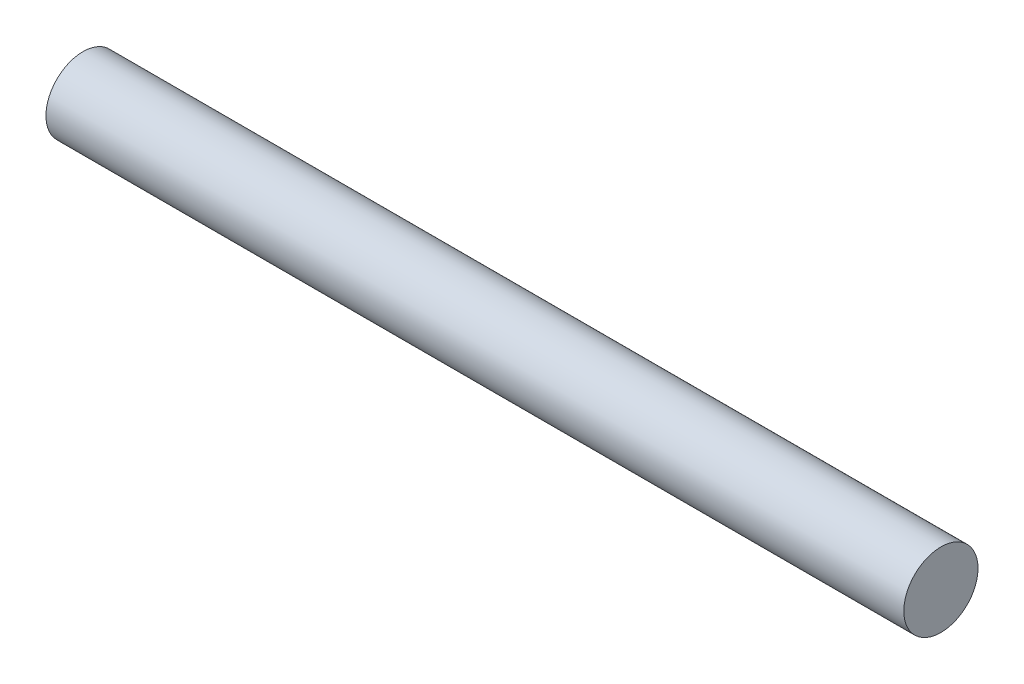
ISO-10303-21;
HEADER;
FILE_DESCRIPTION(('STEP AP214'),'2;1');
FILE_NAME('part.step','',(''),(''),'','','');
FILE_SCHEMA(('AUTOMOTIVE_DESIGN { 1 0 10303 214 1 1 1 1 }'));
ENDSEC;
DATA;
#1=APPLICATION_CONTEXT('core data for automotive mechanical design processes');
#2=APPLICATION_PROTOCOL_DEFINITION('international standard','automotive_design',2000,#1);
#3=PRODUCT_CONTEXT('',#1,'mechanical');
#4=PRODUCT('Part','Part','',(#3));
#5=PRODUCT_RELATED_PRODUCT_CATEGORY('part','',(#4));
#6=PRODUCT_DEFINITION_FORMATION('','',#4);
#7=PRODUCT_DEFINITION_CONTEXT('part definition',#1,'design');
#8=PRODUCT_DEFINITION('design','',#6,#7);
#9=PRODUCT_DEFINITION_SHAPE('','',#8);
#10=(LENGTH_UNIT() NAMED_UNIT(*) SI_UNIT(.MILLI.,.METRE.));
#11=(NAMED_UNIT(*) PLANE_ANGLE_UNIT() SI_UNIT($,.RADIAN.));
#12=(NAMED_UNIT(*) SI_UNIT($,.STERADIAN.) SOLID_ANGLE_UNIT());
#13=UNCERTAINTY_MEASURE_WITH_UNIT(LENGTH_MEASURE(1.E-05),#10,'distance_accuracy_value','');
#14=(GEOMETRIC_REPRESENTATION_CONTEXT(3) GLOBAL_UNCERTAINTY_ASSIGNED_CONTEXT((#13)) GLOBAL_UNIT_ASSIGNED_CONTEXT((#10,
#11,#12)) REPRESENTATION_CONTEXT('',''));
#15=CARTESIAN_POINT('',(0.,0.,0.));
#16=DIRECTION('',(0.,0.,1.));
#17=DIRECTION('',(1.,0.,0.));
#18=AXIS2_PLACEMENT_3D('',#15,#16,#17);
#19=CARTESIAN_POINT('',(37.,0.,0.));
#20=DIRECTION('',(-1.,0.,0.));
#21=DIRECTION('',(0.,0.,1.));
#22=AXIS2_PLACEMENT_3D('',#19,#20,#21);
#23=CYLINDRICAL_SURFACE('',#22,1.6);
#24=CARTESIAN_POINT('',(37.,0.,0.));
#25=DIRECTION('',(1.,0.,0.));
#26=DIRECTION('',(0.,0.,-1.));
#27=AXIS2_PLACEMENT_3D('',#24,#25,#26);
#28=CIRCLE('',#27,1.6);
#29=CARTESIAN_POINT('',(37.,0.,-1.6));
#30=VERTEX_POINT('',#29);
#31=EDGE_CURVE('E10',#30,#30,#28,.T.);
#32=ORIENTED_EDGE('',*,*,#31,.F.);
#33=EDGE_LOOP('',(#32));
#34=FACE_BOUND('',#33,.T.);
#35=CARTESIAN_POINT('',(0.,0.,0.));
#36=DIRECTION('',(1.,0.,0.));
#37=DIRECTION('',(0.,0.,-1.));
#38=AXIS2_PLACEMENT_3D('',#35,#36,#37);
#39=CIRCLE('',#38,1.6);
#40=CARTESIAN_POINT('',(0.,0.,-1.6));
#41=VERTEX_POINT('',#40);
#42=EDGE_CURVE('E36',#41,#41,#39,.T.);
#43=ORIENTED_EDGE('',*,*,#42,.T.);
#44=EDGE_LOOP('',(#43));
#45=FACE_BOUND('',#44,.T.);
#46=ADVANCED_FACE('F33',(#34,#45),#23,.T.);
#47=CARTESIAN_POINT('',(37.,0.,0.));
#48=DIRECTION('',(1.,0.,0.));
#49=DIRECTION('',(0.,0.,-1.));
#50=AXIS2_PLACEMENT_3D('',#47,#48,#49);
#51=PLANE('',#50);
#52=ORIENTED_EDGE('',*,*,#31,.T.);
#53=EDGE_LOOP('',(#52));
#54=FACE_BOUND('',#53,.T.);
#55=ADVANCED_FACE('F48',(#54),#51,.T.);
#56=CARTESIAN_POINT('',(0.,0.,0.));
#57=DIRECTION('',(1.,0.,0.));
#58=DIRECTION('',(0.,0.,-1.));
#59=AXIS2_PLACEMENT_3D('',#56,#57,#58);
#60=PLANE('',#59);
#61=ORIENTED_EDGE('',*,*,#42,.F.);
#62=EDGE_LOOP('',(#61));
#63=FACE_BOUND('',#62,.T.);
#64=ADVANCED_FACE('F46',(#63),#60,.F.);
#65=CLOSED_SHELL('',(#46,#55,#64));
#66=MANIFOLD_SOLID_BREP('B2',#65);
#67=ADVANCED_BREP_SHAPE_REPRESENTATION('',(#18,#66),#14);
#68=SHAPE_DEFINITION_REPRESENTATION(#9,#67);
ENDSEC;
END-ISO-10303-21;
